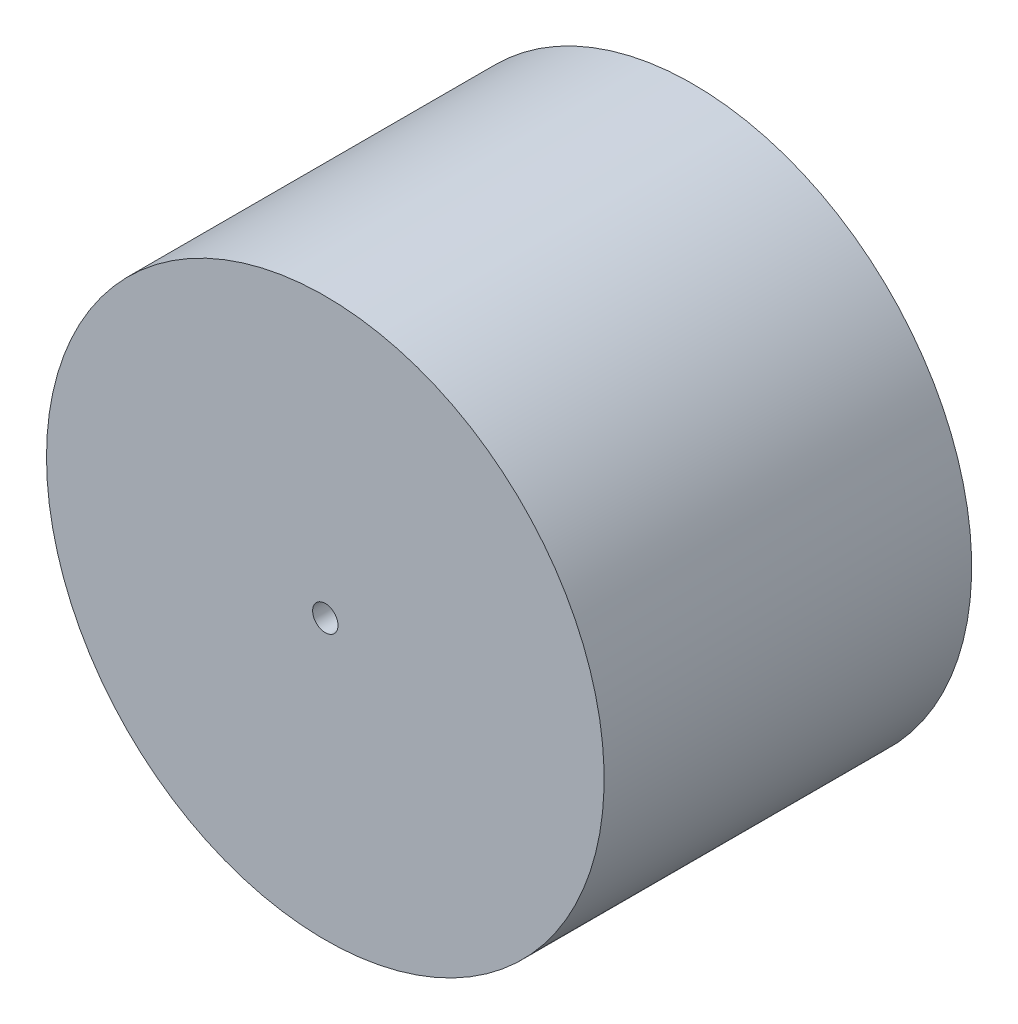
ISO-10303-21;
HEADER;
FILE_DESCRIPTION(('STEP AP214'),'2;1');
FILE_NAME('part.step','',(''),(''),'','','');
FILE_SCHEMA(('AUTOMOTIVE_DESIGN { 1 0 10303 214 1 1 1 1 }'));
ENDSEC;
DATA;
#1=APPLICATION_CONTEXT('core data for automotive mechanical design processes');
#2=APPLICATION_PROTOCOL_DEFINITION('international standard','automotive_design',2000,#1);
#3=PRODUCT_CONTEXT('',#1,'mechanical');
#4=PRODUCT('Part','Part','',(#3));
#5=PRODUCT_RELATED_PRODUCT_CATEGORY('part','',(#4));
#6=PRODUCT_DEFINITION_FORMATION('','',#4);
#7=PRODUCT_DEFINITION_CONTEXT('part definition',#1,'design');
#8=PRODUCT_DEFINITION('design','',#6,#7);
#9=PRODUCT_DEFINITION_SHAPE('','',#8);
#10=(LENGTH_UNIT() NAMED_UNIT(*) SI_UNIT(.MILLI.,.METRE.));
#11=(NAMED_UNIT(*) PLANE_ANGLE_UNIT() SI_UNIT($,.RADIAN.));
#12=(NAMED_UNIT(*) SI_UNIT($,.STERADIAN.) SOLID_ANGLE_UNIT());
#13=UNCERTAINTY_MEASURE_WITH_UNIT(LENGTH_MEASURE(1.E-05),#10,'distance_accuracy_value','');
#14=(GEOMETRIC_REPRESENTATION_CONTEXT(3) GLOBAL_UNCERTAINTY_ASSIGNED_CONTEXT((#13)) GLOBAL_UNIT_ASSIGNED_CONTEXT((#10,
#11,#12)) REPRESENTATION_CONTEXT('',''));
#15=CARTESIAN_POINT('',(0.,0.,0.));
#16=DIRECTION('',(0.,0.,1.));
#17=DIRECTION('',(1.,0.,0.));
#18=AXIS2_PLACEMENT_3D('',#15,#16,#17);
#19=CARTESIAN_POINT('',(0.,0.,29.));
#20=DIRECTION('',(0.,0.,1.));
#21=DIRECTION('',(1.,0.,0.));
#22=AXIS2_PLACEMENT_3D('',#19,#20,#21);
#23=PLANE('',#22);
#24=CARTESIAN_POINT('',(0.,0.,29.));
#25=DIRECTION('',(0.,0.,1.));
#26=DIRECTION('',(1.,0.,0.));
#27=AXIS2_PLACEMENT_3D('',#24,#25,#26);
#28=CIRCLE('',#27,22.);
#29=CARTESIAN_POINT('',(-22.,0.,29.));
#30=VERTEX_POINT('',#29);
#31=EDGE_CURVE('E10',#30,#30,#28,.T.);
#32=ORIENTED_EDGE('',*,*,#31,.T.);
#33=EDGE_LOOP('',(#32));
#34=FACE_BOUND('',#33,.T.);
#35=CARTESIAN_POINT('',(0.,0.,29.));
#36=DIRECTION('',(0.,0.,1.));
#37=DIRECTION('',(1.,0.,0.));
#38=AXIS2_PLACEMENT_3D('',#35,#36,#37);
#39=CIRCLE('',#38,1.);
#40=CARTESIAN_POINT('',(-1.,0.,29.));
#41=VERTEX_POINT('',#40);
#42=EDGE_CURVE('E41',#41,#41,#39,.T.);
#43=ORIENTED_EDGE('',*,*,#42,.F.);
#44=EDGE_LOOP('',(#43));
#45=FACE_BOUND('',#44,.T.);
#46=ADVANCED_FACE('F30',(#34,#45),#23,.T.);
#47=CARTESIAN_POINT('',(0.,0.,0.));
#48=DIRECTION('',(0.,0.,1.));
#49=DIRECTION('',(1.,0.,0.));
#50=AXIS2_PLACEMENT_3D('',#47,#48,#49);
#51=PLANE('',#50);
#52=CARTESIAN_POINT('',(0.,0.,0.));
#53=DIRECTION('',(0.,0.,1.));
#54=DIRECTION('',(1.,0.,0.));
#55=AXIS2_PLACEMENT_3D('',#52,#53,#54);
#56=CIRCLE('',#55,22.);
#57=CARTESIAN_POINT('',(-22.,0.,0.));
#58=VERTEX_POINT('',#57);
#59=EDGE_CURVE('E34',#58,#58,#56,.T.);
#60=ORIENTED_EDGE('',*,*,#59,.F.);
#61=EDGE_LOOP('',(#60));
#62=FACE_BOUND('',#61,.T.);
#63=CARTESIAN_POINT('',(0.,0.,0.));
#64=DIRECTION('',(0.,0.,1.));
#65=DIRECTION('',(1.,0.,0.));
#66=AXIS2_PLACEMENT_3D('',#63,#64,#65);
#67=CIRCLE('',#66,1.);
#68=CARTESIAN_POINT('',(-1.,0.,0.));
#69=VERTEX_POINT('',#68);
#70=EDGE_CURVE('E43',#69,#69,#67,.T.);
#71=ORIENTED_EDGE('',*,*,#70,.T.);
#72=EDGE_LOOP('',(#71));
#73=FACE_BOUND('',#72,.T.);
#74=ADVANCED_FACE('F53',(#62,#73),#51,.F.);
#75=CARTESIAN_POINT('',(0.,0.,29.));
#76=DIRECTION('',(0.,0.,-1.));
#77=DIRECTION('',(-1.,0.,0.));
#78=AXIS2_PLACEMENT_3D('',#75,#76,#77);
#79=CYLINDRICAL_SURFACE('',#78,22.);
#80=CARTESIAN_POINT('',(-22.,0.,29.));
#81=CARTESIAN_POINT('',(-22.,0.,28.6979166666667));
#82=CARTESIAN_POINT('',(-22.,0.,28.3958333333333));
#83=CARTESIAN_POINT('',(-22.,0.,27.7916666666667));
#84=CARTESIAN_POINT('',(-22.,0.,27.4895833333333));
#85=CARTESIAN_POINT('',(-22.,0.,26.8854166666667));
#86=CARTESIAN_POINT('',(-22.,0.,26.5833333333333));
#87=CARTESIAN_POINT('',(-22.,0.,25.9791666666667));
#88=CARTESIAN_POINT('',(-22.,0.,25.6770833333333));
#89=CARTESIAN_POINT('',(-22.,0.,25.0729166666667));
#90=CARTESIAN_POINT('',(-22.,0.,24.7708333333333));
#91=CARTESIAN_POINT('',(-22.,0.,24.1666666666667));
#92=CARTESIAN_POINT('',(-22.,0.,23.8645833333333));
#93=CARTESIAN_POINT('',(-22.,0.,23.2604166666667));
#94=CARTESIAN_POINT('',(-22.,0.,22.9583333333333));
#95=CARTESIAN_POINT('',(-22.,0.,22.3541666666667));
#96=CARTESIAN_POINT('',(-22.,0.,22.0520833333333));
#97=CARTESIAN_POINT('',(-22.,0.,21.4479166666667));
#98=CARTESIAN_POINT('',(-22.,0.,21.1458333333333));
#99=CARTESIAN_POINT('',(-22.,0.,20.5416666666667));
#100=CARTESIAN_POINT('',(-22.,0.,20.2395833333333));
#101=CARTESIAN_POINT('',(-22.,0.,19.6354166666667));
#102=CARTESIAN_POINT('',(-22.,0.,19.3333333333333));
#103=CARTESIAN_POINT('',(-22.,0.,18.7291666666667));
#104=CARTESIAN_POINT('',(-22.,0.,18.4270833333333));
#105=CARTESIAN_POINT('',(-22.,0.,17.8229166666667));
#106=CARTESIAN_POINT('',(-22.,0.,17.5208333333333));
#107=CARTESIAN_POINT('',(-22.,0.,16.9166666666667));
#108=CARTESIAN_POINT('',(-22.,0.,16.6145833333333));
#109=CARTESIAN_POINT('',(-22.,0.,16.0104166666667));
#110=CARTESIAN_POINT('',(-22.,0.,15.7083333333333));
#111=CARTESIAN_POINT('',(-22.,0.,15.1041666666667));
#112=CARTESIAN_POINT('',(-22.,0.,14.8020833333333));
#113=CARTESIAN_POINT('',(-22.,0.,14.1979166666667));
#114=CARTESIAN_POINT('',(-22.,0.,13.8958333333333));
#115=CARTESIAN_POINT('',(-22.,0.,13.2916666666667));
#116=CARTESIAN_POINT('',(-22.,0.,12.9895833333333));
#117=CARTESIAN_POINT('',(-22.,0.,12.3854166666667));
#118=CARTESIAN_POINT('',(-22.,0.,12.0833333333333));
#119=CARTESIAN_POINT('',(-22.,0.,11.4791666666667));
#120=CARTESIAN_POINT('',(-22.,0.,11.1770833333333));
#121=CARTESIAN_POINT('',(-22.,0.,10.5729166666667));
#122=CARTESIAN_POINT('',(-22.,0.,10.2708333333333));
#123=CARTESIAN_POINT('',(-22.,0.,9.66666666666667));
#124=CARTESIAN_POINT('',(-22.,0.,9.36458333333333));
#125=CARTESIAN_POINT('',(-22.,0.,8.76041666666667));
#126=CARTESIAN_POINT('',(-22.,0.,8.45833333333333));
#127=CARTESIAN_POINT('',(-22.,0.,7.85416666666667));
#128=CARTESIAN_POINT('',(-22.,0.,7.55208333333333));
#129=CARTESIAN_POINT('',(-22.,0.,6.94791666666667));
#130=CARTESIAN_POINT('',(-22.,0.,6.64583333333333));
#131=CARTESIAN_POINT('',(-22.,0.,6.04166666666667));
#132=CARTESIAN_POINT('',(-22.,0.,5.73958333333333));
#133=CARTESIAN_POINT('',(-22.,0.,5.13541666666667));
#134=CARTESIAN_POINT('',(-22.,0.,4.83333333333333));
#135=CARTESIAN_POINT('',(-22.,0.,4.22916666666667));
#136=CARTESIAN_POINT('',(-22.,0.,3.92708333333333));
#137=CARTESIAN_POINT('',(-22.,0.,3.32291666666667));
#138=CARTESIAN_POINT('',(-22.,0.,3.02083333333333));
#139=CARTESIAN_POINT('',(-22.,0.,2.41666666666667));
#140=CARTESIAN_POINT('',(-22.,0.,2.11458333333333));
#141=CARTESIAN_POINT('',(-22.,0.,1.51041666666667));
#142=CARTESIAN_POINT('',(-22.,0.,1.20833333333333));
#143=CARTESIAN_POINT('',(-22.,0.,0.604166666666667));
#144=CARTESIAN_POINT('',(-22.,0.,0.302083333333333));
#145=CARTESIAN_POINT('',(-22.,0.,0.));
#146=B_SPLINE_CURVE_WITH_KNOTS('',3,(#80,#81,#82,#83,#84,#85,#86,#87,#88,#89,#90,#91,#92,#93,
#94,#95,#96,#97,#98,#99,#100,#101,#102,#103,#104,#105,#106,#107,#108,#109,#110,#111,#112,#113,
#114,#115,#116,#117,#118,#119,#120,#121,#122,#123,#124,#125,#126,#127,#128,#129,#130,#131,#132,
#133,#134,#135,#136,#137,#138,#139,#140,#141,#142,#143,#144,#145),.UNSPECIFIED.,.F.,.F.,(4,2,2,
2,2,2,2,2,2,2,2,2,2,2,2,2,2,2,2,2,2,2,2,2,2,2,2,2,2,2,2,2,4),(0.,0.906250000000001,1.8125,
2.71875,3.625,4.53125,5.4375,6.34375,7.25,8.15625,9.0625,9.96875,10.875,11.78125,12.6875,
13.59375,14.5,15.40625,16.3125,17.21875,18.125,19.03125,19.9375,20.84375,21.75,22.65625,23.5625,
24.46875,25.375,26.28125,27.1875,28.09375,29.),.UNSPECIFIED.);
#147=EDGE_CURVE('BSEAM32',#30,#58,#146,.T.);
#148=ORIENTED_EDGE('',*,*,#31,.F.);
#149=ORIENTED_EDGE('',*,*,#59,.T.);
#150=ORIENTED_EDGE('',*,*,#147,.T.);
#151=ORIENTED_EDGE('',*,*,#147,.F.);
#152=EDGE_LOOP('',(#148,#150,#149,#151));
#153=FACE_BOUND('',#152,.T.);
#154=ADVANCED_FACE('F32',(#153),#79,.T.);
#155=CARTESIAN_POINT('',(0.,0.,29.));
#156=DIRECTION('',(0.,0.,-1.));
#157=DIRECTION('',(-1.,0.,0.));
#158=AXIS2_PLACEMENT_3D('',#155,#156,#157);
#159=CYLINDRICAL_SURFACE('',#158,1.);
#160=CARTESIAN_POINT('',(-1.,0.,29.));
#161=CARTESIAN_POINT('',(-1.,0.,28.6979166666667));
#162=CARTESIAN_POINT('',(-1.,0.,28.3958333333333));
#163=CARTESIAN_POINT('',(-1.,0.,27.7916666666667));
#164=CARTESIAN_POINT('',(-1.,0.,27.4895833333333));
#165=CARTESIAN_POINT('',(-1.,0.,26.8854166666667));
#166=CARTESIAN_POINT('',(-1.,0.,26.5833333333333));
#167=CARTESIAN_POINT('',(-1.,0.,25.9791666666667));
#168=CARTESIAN_POINT('',(-1.,0.,25.6770833333333));
#169=CARTESIAN_POINT('',(-1.,0.,25.0729166666667));
#170=CARTESIAN_POINT('',(-1.,0.,24.7708333333333));
#171=CARTESIAN_POINT('',(-1.,0.,24.1666666666667));
#172=CARTESIAN_POINT('',(-1.,0.,23.8645833333333));
#173=CARTESIAN_POINT('',(-1.,0.,23.2604166666667));
#174=CARTESIAN_POINT('',(-1.,0.,22.9583333333333));
#175=CARTESIAN_POINT('',(-1.,0.,22.3541666666667));
#176=CARTESIAN_POINT('',(-1.,0.,22.0520833333333));
#177=CARTESIAN_POINT('',(-1.,0.,21.4479166666667));
#178=CARTESIAN_POINT('',(-1.,0.,21.1458333333333));
#179=CARTESIAN_POINT('',(-1.,0.,20.5416666666667));
#180=CARTESIAN_POINT('',(-1.,0.,20.2395833333333));
#181=CARTESIAN_POINT('',(-1.,0.,19.6354166666667));
#182=CARTESIAN_POINT('',(-1.,0.,19.3333333333333));
#183=CARTESIAN_POINT('',(-1.,0.,18.7291666666667));
#184=CARTESIAN_POINT('',(-1.,0.,18.4270833333333));
#185=CARTESIAN_POINT('',(-1.,0.,17.8229166666667));
#186=CARTESIAN_POINT('',(-1.,0.,17.5208333333333));
#187=CARTESIAN_POINT('',(-1.,0.,16.9166666666667));
#188=CARTESIAN_POINT('',(-1.,0.,16.6145833333333));
#189=CARTESIAN_POINT('',(-1.,0.,16.0104166666667));
#190=CARTESIAN_POINT('',(-1.,0.,15.7083333333333));
#191=CARTESIAN_POINT('',(-1.,0.,15.1041666666667));
#192=CARTESIAN_POINT('',(-1.,0.,14.8020833333333));
#193=CARTESIAN_POINT('',(-1.,0.,14.1979166666667));
#194=CARTESIAN_POINT('',(-1.,0.,13.8958333333333));
#195=CARTESIAN_POINT('',(-1.,0.,13.2916666666667));
#196=CARTESIAN_POINT('',(-1.,0.,12.9895833333333));
#197=CARTESIAN_POINT('',(-1.,0.,12.3854166666667));
#198=CARTESIAN_POINT('',(-1.,0.,12.0833333333333));
#199=CARTESIAN_POINT('',(-1.,0.,11.4791666666667));
#200=CARTESIAN_POINT('',(-1.,0.,11.1770833333333));
#201=CARTESIAN_POINT('',(-1.,0.,10.5729166666667));
#202=CARTESIAN_POINT('',(-1.,0.,10.2708333333333));
#203=CARTESIAN_POINT('',(-1.,0.,9.66666666666667));
#204=CARTESIAN_POINT('',(-1.,0.,9.36458333333333));
#205=CARTESIAN_POINT('',(-1.,0.,8.76041666666667));
#206=CARTESIAN_POINT('',(-1.,0.,8.45833333333333));
#207=CARTESIAN_POINT('',(-1.,0.,7.85416666666667));
#208=CARTESIAN_POINT('',(-1.,0.,7.55208333333333));
#209=CARTESIAN_POINT('',(-1.,0.,6.94791666666667));
#210=CARTESIAN_POINT('',(-1.,0.,6.64583333333333));
#211=CARTESIAN_POINT('',(-1.,0.,6.04166666666667));
#212=CARTESIAN_POINT('',(-1.,0.,5.73958333333333));
#213=CARTESIAN_POINT('',(-1.,0.,5.13541666666667));
#214=CARTESIAN_POINT('',(-1.,0.,4.83333333333333));
#215=CARTESIAN_POINT('',(-1.,0.,4.22916666666667));
#216=CARTESIAN_POINT('',(-1.,0.,3.92708333333333));
#217=CARTESIAN_POINT('',(-1.,0.,3.32291666666667));
#218=CARTESIAN_POINT('',(-1.,0.,3.02083333333333));
#219=CARTESIAN_POINT('',(-1.,0.,2.41666666666667));
#220=CARTESIAN_POINT('',(-1.,0.,2.11458333333333));
#221=CARTESIAN_POINT('',(-1.,0.,1.51041666666667));
#222=CARTESIAN_POINT('',(-1.,0.,1.20833333333333));
#223=CARTESIAN_POINT('',(-1.,0.,0.604166666666667));
#224=CARTESIAN_POINT('',(-1.,0.,0.302083333333333));
#225=CARTESIAN_POINT('',(-1.,0.,0.));
#226=B_SPLINE_CURVE_WITH_KNOTS('',3,(#160,#161,#162,#163,#164,#165,#166,#167,#168,#169,#170,
#171,#172,#173,#174,#175,#176,#177,#178,#179,#180,#181,#182,#183,#184,#185,#186,#187,#188,#189,
#190,#191,#192,#193,#194,#195,#196,#197,#198,#199,#200,#201,#202,#203,#204,#205,#206,#207,#208,
#209,#210,#211,#212,#213,#214,#215,#216,#217,#218,#219,#220,#221,#222,#223,#224,#225),
.UNSPECIFIED.,.F.,.F.,(4,2,2,2,2,2,2,2,2,2,2,2,2,2,2,2,2,2,2,2,2,2,2,2,2,2,2,2,2,2,2,2,4),(0.,
0.906249999999997,1.8125,2.71875,3.625,4.53125,5.4375,6.34375,7.25,8.15625,9.0625,9.96875,
10.875,11.78125,12.6875,13.59375,14.5,15.40625,16.3125,17.21875,18.125,19.03125,19.9375,
20.84375,21.75,22.65625,23.5625,24.46875,25.375,26.28125,27.1875,28.09375,29.),.UNSPECIFIED.);
#227=EDGE_CURVE('BSEAM49',#41,#69,#226,.T.);
#228=ORIENTED_EDGE('',*,*,#42,.T.);
#229=ORIENTED_EDGE('',*,*,#70,.F.);
#230=ORIENTED_EDGE('',*,*,#227,.T.);
#231=ORIENTED_EDGE('',*,*,#227,.F.);
#232=EDGE_LOOP('',(#228,#230,#229,#231));
#233=FACE_BOUND('',#232,.T.);
#234=ADVANCED_FACE('F49',(#233),#159,.F.);
#235=CLOSED_SHELL('',(#46,#74,#154,#234));
#236=MANIFOLD_SOLID_BREP('B2',#235);
#237=ADVANCED_BREP_SHAPE_REPRESENTATION('',(#18,#236),#14);
#238=SHAPE_DEFINITION_REPRESENTATION(#9,#237);
ENDSEC;
END-ISO-10303-21;
